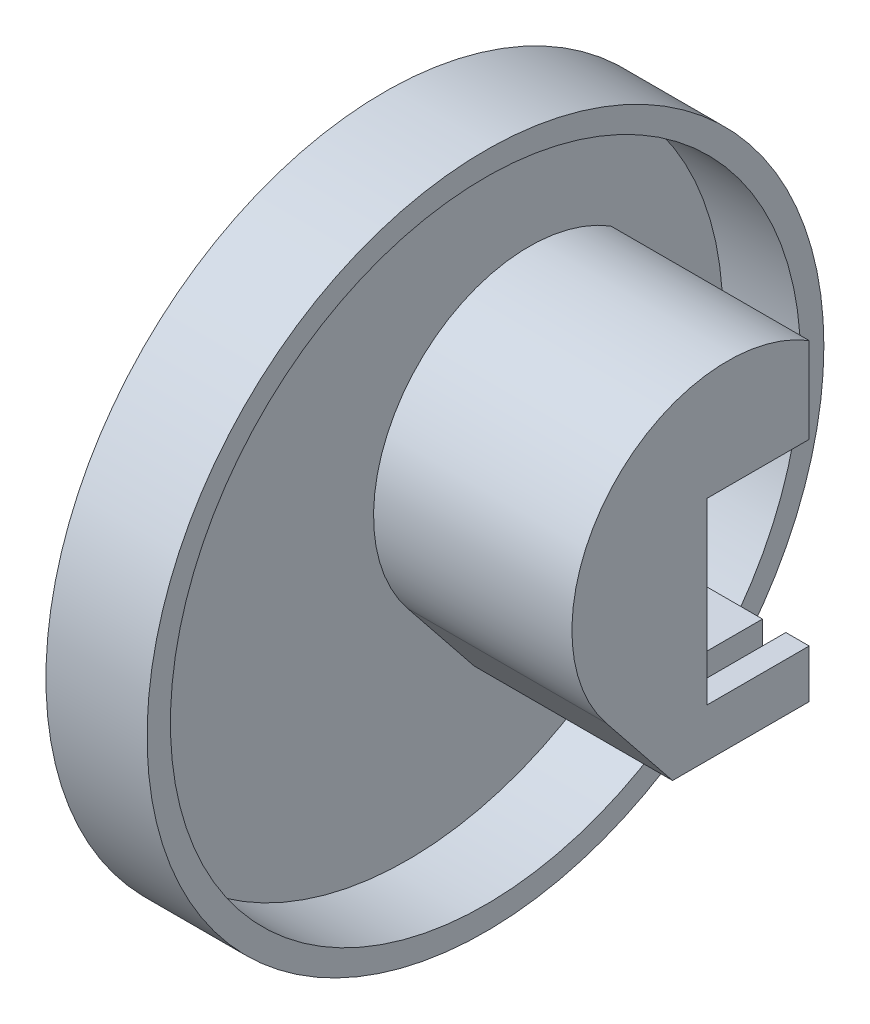
ISO-10303-21;
HEADER;
FILE_DESCRIPTION(('STEP AP214'),'2;1');
FILE_NAME('part.step','',(''),(''),'','','');
FILE_SCHEMA(('AUTOMOTIVE_DESIGN { 1 0 10303 214 1 1 1 1 }'));
ENDSEC;
DATA;
#1=APPLICATION_CONTEXT('core data for automotive mechanical design processes');
#2=APPLICATION_PROTOCOL_DEFINITION('international standard','automotive_design',2000,#1);
#3=PRODUCT_CONTEXT('',#1,'mechanical');
#4=PRODUCT('Part','Part','',(#3));
#5=PRODUCT_RELATED_PRODUCT_CATEGORY('part','',(#4));
#6=PRODUCT_DEFINITION_FORMATION('','',#4);
#7=PRODUCT_DEFINITION_CONTEXT('part definition',#1,'design');
#8=PRODUCT_DEFINITION('design','',#6,#7);
#9=PRODUCT_DEFINITION_SHAPE('','',#8);
#10=(LENGTH_UNIT() NAMED_UNIT(*) SI_UNIT(.MILLI.,.METRE.));
#11=(NAMED_UNIT(*) PLANE_ANGLE_UNIT() SI_UNIT($,.RADIAN.));
#12=(NAMED_UNIT(*) SI_UNIT($,.STERADIAN.) SOLID_ANGLE_UNIT());
#13=UNCERTAINTY_MEASURE_WITH_UNIT(LENGTH_MEASURE(1.E-05),#10,'distance_accuracy_value','');
#14=(GEOMETRIC_REPRESENTATION_CONTEXT(3) GLOBAL_UNCERTAINTY_ASSIGNED_CONTEXT((#13)) GLOBAL_UNIT_ASSIGNED_CONTEXT((#10,
#11,#12)) REPRESENTATION_CONTEXT('',''));
#15=CARTESIAN_POINT('',(0.,0.,0.));
#16=DIRECTION('',(0.,0.,1.));
#17=DIRECTION('',(1.,0.,0.));
#18=AXIS2_PLACEMENT_3D('',#15,#16,#17);
#19=CARTESIAN_POINT('',(19.5,0.,-15.612494995996));
#20=DIRECTION('',(1.,0.,0.));
#21=DIRECTION('',(0.,0.,-1.));
#22=AXIS2_PLACEMENT_3D('',#19,#20,#21);
#23=PLANE('',#22);
#24=DIRECTION('',(0.,1.,0.));
#25=VECTOR('',#24,1.);
#26=CARTESIAN_POINT('',(19.5,0.,-13.));
#27=LINE('',#26,#25);
#28=CARTESIAN_POINT('',(19.5,-23.1771451300606,-13.));
#29=VERTEX_POINT('',#28);
#30=CARTESIAN_POINT('',(19.5,-16.9771451300606,-13.));
#31=VERTEX_POINT('',#30);
#32=EDGE_CURVE('E51',#29,#31,#27,.T.);
#33=ORIENTED_EDGE('',*,*,#32,.F.);
#34=DIRECTION('',(0.,0.,-1.));
#35=VECTOR('',#34,1.);
#36=CARTESIAN_POINT('',(19.5,-23.1771451300607,0.));
#37=LINE('',#36,#35);
#38=CARTESIAN_POINT('',(19.5,-23.1771451300606,-26.1111812031832));
#39=VERTEX_POINT('',#38);
#40=EDGE_CURVE('E231',#29,#39,#37,.T.);
#41=ORIENTED_EDGE('',*,*,#40,.T.);
#42=DIRECTION('',(0.,1.,0.));
#43=VECTOR('',#42,1.);
#44=CARTESIAN_POINT('',(19.5,0.,-26.1111812031832));
#45=LINE('',#44,#43);
#46=CARTESIAN_POINT('',(19.5,-16.9771451300606,-26.1111812031832));
#47=VERTEX_POINT('',#46);
#48=EDGE_CURVE('E233',#39,#47,#45,.T.);
#49=ORIENTED_EDGE('',*,*,#48,.T.);
#50=DIRECTION('',(0.,0.,1.));
#51=VECTOR('',#50,1.);
#52=CARTESIAN_POINT('',(19.5,-16.9771451300606,0.));
#53=LINE('',#52,#51);
#54=EDGE_CURVE('E222',#47,#31,#53,.T.);
#55=ORIENTED_EDGE('',*,*,#54,.T.);
#56=EDGE_LOOP('',(#33,#41,#49,#55));
#57=FACE_BOUND('',#56,.T.);
#58=ADVANCED_FACE('F41',(#57),#23,.T.);
#59=CARTESIAN_POINT('',(10.,0.,0.));
#60=DIRECTION('',(1.,0.,0.));
#61=DIRECTION('',(0.,0.,-1.));
#62=AXIS2_PLACEMENT_3D('',#59,#60,#61);
#63=PLANE('',#62);
#64=CARTESIAN_POINT('',(10.,0.,0.));
#65=DIRECTION('',(1.,0.,0.));
#66=DIRECTION('',(0.,0.,-1.));
#67=AXIS2_PLACEMENT_3D('',#64,#65,#66);
#68=CIRCLE('',#67,43.5);
#69=CARTESIAN_POINT('',(10.,0.,-43.5));
#70=VERTEX_POINT('',#69);
#71=EDGE_CURVE('E45',#70,#70,#68,.T.);
#72=ORIENTED_EDGE('',*,*,#71,.T.);
#73=EDGE_LOOP('',(#72));
#74=FACE_BOUND('',#73,.T.);
#75=CARTESIAN_POINT('',(10.,0.,0.));
#76=DIRECTION('',(1.,0.,0.));
#77=DIRECTION('',(0.,0.,-1.));
#78=AXIS2_PLACEMENT_3D('',#75,#76,#77);
#79=CIRCLE('',#78,40.5);
#80=CARTESIAN_POINT('',(10.,0.,-40.5));
#81=VERTEX_POINT('',#80);
#82=EDGE_CURVE('E301',#81,#81,#79,.T.);
#83=ORIENTED_EDGE('',*,*,#82,.F.);
#84=EDGE_LOOP('',(#83));
#85=FACE_BOUND('',#84,.T.);
#86=ADVANCED_FACE('F320',(#74,#85),#63,.T.);
#87=CARTESIAN_POINT('',(10.,0.,0.));
#88=DIRECTION('',(-1.,0.,0.));
#89=DIRECTION('',(0.,0.,1.));
#90=AXIS2_PLACEMENT_3D('',#87,#88,#89);
#91=CYLINDRICAL_SURFACE('',#90,43.5);
#92=ORIENTED_EDGE('',*,*,#71,.F.);
#93=EDGE_LOOP('',(#92));
#94=FACE_BOUND('',#93,.T.);
#95=CARTESIAN_POINT('',(-3.,0.,0.));
#96=DIRECTION('',(1.,0.,0.));
#97=DIRECTION('',(0.,0.,-1.));
#98=AXIS2_PLACEMENT_3D('',#95,#96,#97);
#99=CIRCLE('',#98,43.5);
#100=CARTESIAN_POINT('',(-3.,0.,-43.5));
#101=VERTEX_POINT('',#100);
#102=EDGE_CURVE('E297',#101,#101,#99,.T.);
#103=ORIENTED_EDGE('',*,*,#102,.T.);
#104=EDGE_LOOP('',(#103));
#105=FACE_BOUND('',#104,.T.);
#106=ADVANCED_FACE('F43',(#94,#105),#91,.T.);
#107=CARTESIAN_POINT('',(10.,0.,0.));
#108=DIRECTION('',(-1.,0.,0.));
#109=DIRECTION('',(0.,0.,1.));
#110=AXIS2_PLACEMENT_3D('',#107,#108,#109);
#111=CYLINDRICAL_SURFACE('',#110,40.5);
#112=ORIENTED_EDGE('',*,*,#82,.T.);
#113=EDGE_LOOP('',(#112));
#114=FACE_BOUND('',#113,.T.);
#115=CARTESIAN_POINT('',(0.,0.,0.));
#116=DIRECTION('',(1.,0.,0.));
#117=DIRECTION('',(0.,0.,-1.));
#118=AXIS2_PLACEMENT_3D('',#115,#116,#117);
#119=CIRCLE('',#118,40.5);
#120=CARTESIAN_POINT('',(0.,0.,-40.5));
#121=VERTEX_POINT('',#120);
#122=EDGE_CURVE('E300',#121,#121,#119,.T.);
#123=ORIENTED_EDGE('',*,*,#122,.F.);
#124=EDGE_LOOP('',(#123));
#125=FACE_BOUND('',#124,.T.);
#126=ADVANCED_FACE('F308',(#114,#125),#111,.F.);
#127=CARTESIAN_POINT('',(0.,0.,0.));
#128=DIRECTION('',(1.,0.,0.));
#129=DIRECTION('',(0.,0.,-1.));
#130=AXIS2_PLACEMENT_3D('',#127,#128,#129);
#131=PLANE('',#130);
#132=DIRECTION('',(0.,-1.,0.));
#133=VECTOR('',#132,1.);
#134=CARTESIAN_POINT('',(0.,0.,-13.));
#135=LINE('',#134,#133);
#136=CARTESIAN_POINT('',(0.,-15.6771451300606,-13.));
#137=VERTEX_POINT('',#136);
#138=CARTESIAN_POINT('',(0.,-23.1771451300606,-13.));
#139=VERTEX_POINT('',#138);
#140=EDGE_CURVE('E261',#137,#139,#135,.T.);
#141=ORIENTED_EDGE('',*,*,#140,.T.);
#142=DIRECTION('',(0.,0.,1.));
#143=VECTOR('',#142,1.);
#144=CARTESIAN_POINT('',(0.,-23.1771451300607,0.));
#145=LINE('',#144,#143);
#146=CARTESIAN_POINT('',(0.,-23.1771451300607,-8.54855768792795));
#147=VERTEX_POINT('',#146);
#148=EDGE_CURVE('E264',#139,#147,#145,.T.);
#149=ORIENTED_EDGE('',*,*,#148,.T.);
#150=DIRECTION('',(0.,0.7806247497998,0.625));
#151=VECTOR('',#150,1.);
#152=CARTESIAN_POINT('',(0.,-4.8828125,6.09863085781094));
#153=LINE('',#152,#151);
#154=CARTESIAN_POINT('',(0.,-12.5,0.));
#155=VERTEX_POINT('',#154);
#156=EDGE_CURVE('E277',#147,#155,#153,.T.);
#157=ORIENTED_EDGE('',*,*,#156,.T.);
#158=CARTESIAN_POINT('',(0.,0.,-15.612494995996));
#159=DIRECTION('',(1.,0.,0.));
#160=DIRECTION('',(0.,0.,-1.));
#161=AXIS2_PLACEMENT_3D('',#158,#159,#160);
#162=CIRCLE('',#161,20.);
#163=CARTESIAN_POINT('',(0.,17.0228548699394,-26.1111812031832));
#164=VERTEX_POINT('',#163);
#165=EDGE_CURVE('E274',#164,#155,#162,.T.);
#166=ORIENTED_EDGE('',*,*,#165,.F.);
#167=DIRECTION('',(0.,-1.,0.));
#168=VECTOR('',#167,1.);
#169=CARTESIAN_POINT('',(0.,0.,-26.1111812031832));
#170=LINE('',#169,#168);
#171=CARTESIAN_POINT('',(0.,15.5228548699394,-26.1111812031832));
#172=VERTEX_POINT('',#171);
#173=EDGE_CURVE('E272',#164,#172,#170,.T.);
#174=ORIENTED_EDGE('',*,*,#173,.T.);
#175=CARTESIAN_POINT('',(0.,0.13117056936177,-19.0598725025692));
#176=DIRECTION('',(1.,0.,0.));
#177=DIRECTION('',(0.,0.,-1.));
#178=AXIS2_PLACEMENT_3D('',#175,#176,#177);
#179=CIRCLE('',#178,16.93);
#180=EDGE_CURVE('E269',#137,#172,#179,.F.);
#181=ORIENTED_EDGE('',*,*,#180,.F.);
#182=EDGE_LOOP('',(#141,#149,#157,#166,#174,#181));
#183=FACE_BOUND('',#182,.T.);
#184=ORIENTED_EDGE('',*,*,#122,.T.);
#185=EDGE_LOOP('',(#184));
#186=FACE_BOUND('',#185,.T.);
#187=ADVANCED_FACE('F306',(#183,#186),#131,.T.);
#188=CARTESIAN_POINT('',(-3.,0.,0.));
#189=DIRECTION('',(1.,0.,0.));
#190=DIRECTION('',(0.,0.,-1.));
#191=AXIS2_PLACEMENT_3D('',#188,#189,#190);
#192=PLANE('',#191);
#193=ORIENTED_EDGE('',*,*,#102,.F.);
#194=EDGE_LOOP('',(#193));
#195=FACE_BOUND('',#194,.T.);
#196=ADVANCED_FACE('F317',(#195),#192,.F.);
#197=CARTESIAN_POINT('',(12.,0.,-13.));
#198=DIRECTION('',(0.,0.,-1.));
#199=DIRECTION('',(0.,1.,0.));
#200=AXIS2_PLACEMENT_3D('',#197,#198,#199);
#201=PLANE('',#200);
#202=ORIENTED_EDGE('',*,*,#140,.F.);
#203=DIRECTION('',(-1.,0.,0.));
#204=VECTOR('',#203,1.);
#205=CARTESIAN_POINT('',(12.,-15.6771451300606,-13.));
#206=LINE('',#205,#204);
#207=CARTESIAN_POINT('',(12.,-15.6771451300606,-13.));
#208=VERTEX_POINT('',#207);
#209=EDGE_CURVE('E294',#208,#137,#206,.T.);
#210=ORIENTED_EDGE('',*,*,#209,.F.);
#211=DIRECTION('',(0.,1.,0.));
#212=VECTOR('',#211,1.);
#213=CARTESIAN_POINT('',(12.,0.,-13.));
#214=LINE('',#213,#212);
#215=CARTESIAN_POINT('',(12.,6.02285486993935,-13.));
#216=VERTEX_POINT('',#215);
#217=EDGE_CURVE('E238',#208,#216,#214,.T.);
#218=ORIENTED_EDGE('',*,*,#217,.T.);
#219=DIRECTION('',(-1.,0.,0.));
#220=VECTOR('',#219,1.);
#221=CARTESIAN_POINT('',(19.5,6.02285486993935,-13.));
#222=LINE('',#221,#220);
#223=CARTESIAN_POINT('',(19.5,6.02285486993935,-13.));
#224=VERTEX_POINT('',#223);
#225=EDGE_CURVE('E256',#224,#216,#222,.T.);
#226=ORIENTED_EDGE('',*,*,#225,.F.);
#227=CARTESIAN_POINT('',(19.5,11.3228548699394,-13.));
#228=VERTEX_POINT('',#227);
#229=EDGE_CURVE('E11',#224,#228,#27,.T.);
#230=ORIENTED_EDGE('',*,*,#229,.T.);
#231=DIRECTION('',(-1.,0.,0.));
#232=VECTOR('',#231,1.);
#233=CARTESIAN_POINT('',(22.5,11.3228548699394,-13.));
#234=LINE('',#233,#232);
#235=CARTESIAN_POINT('',(22.5,11.3228548699394,-13.));
#236=VERTEX_POINT('',#235);
#237=EDGE_CURVE('E58',#236,#228,#234,.T.);
#238=ORIENTED_EDGE('',*,*,#237,.F.);
#239=DIRECTION('',(0.,1.,0.));
#240=VECTOR('',#239,1.);
#241=CARTESIAN_POINT('',(22.5,0.,-13.));
#242=LINE('',#241,#240);
#243=CARTESIAN_POINT('',(22.5,6.02285486993935,-13.));
#244=VERTEX_POINT('',#243);
#245=EDGE_CURVE('E212',#244,#236,#242,.T.);
#246=ORIENTED_EDGE('',*,*,#245,.F.);
#247=DIRECTION('',(-1.,0.,0.));
#248=VECTOR('',#247,1.);
#249=CARTESIAN_POINT('',(25.5,6.02285486993935,-13.));
#250=LINE('',#249,#248);
#251=CARTESIAN_POINT('',(25.5,6.02285486993935,-13.));
#252=VERTEX_POINT('',#251);
#253=EDGE_CURVE('E185',#252,#244,#250,.T.);
#254=ORIENTED_EDGE('',*,*,#253,.F.);
#255=DIRECTION('',(0.,1.,0.));
#256=VECTOR('',#255,1.);
#257=CARTESIAN_POINT('',(25.5,0.,-13.));
#258=LINE('',#257,#256);
#259=CARTESIAN_POINT('',(25.5,-16.9771451300606,-13.));
#260=VERTEX_POINT('',#259);
#261=EDGE_CURVE('E176',#260,#252,#258,.T.);
#262=ORIENTED_EDGE('',*,*,#261,.F.);
#263=DIRECTION('',(-1.,0.,0.));
#264=VECTOR('',#263,1.);
#265=CARTESIAN_POINT('',(25.5,-16.9771451300606,-13.));
#266=LINE('',#265,#264);
#267=CARTESIAN_POINT('',(22.5,-16.9771451300606,-13.));
#268=VERTEX_POINT('',#267);
#269=EDGE_CURVE('E182',#260,#268,#266,.T.);
#270=ORIENTED_EDGE('',*,*,#269,.T.);
#271=CARTESIAN_POINT('',(22.5,-23.1771451300606,-13.));
#272=VERTEX_POINT('',#271);
#273=EDGE_CURVE('E209',#272,#268,#242,.T.);
#274=ORIENTED_EDGE('',*,*,#273,.F.);
#275=DIRECTION('',(-1.,0.,0.));
#276=VECTOR('',#275,1.);
#277=CARTESIAN_POINT('',(22.5,-23.1771451300606,-13.));
#278=LINE('',#277,#276);
#279=EDGE_CURVE('E213',#272,#29,#278,.T.);
#280=ORIENTED_EDGE('',*,*,#279,.T.);
#281=ORIENTED_EDGE('',*,*,#32,.T.);
#282=DIRECTION('',(-1.,0.,0.));
#283=VECTOR('',#282,1.);
#284=CARTESIAN_POINT('',(19.5,-16.9771451300606,-13.));
#285=LINE('',#284,#283);
#286=CARTESIAN_POINT('',(12.,-16.9771451300606,-13.));
#287=VERTEX_POINT('',#286);
#288=EDGE_CURVE('E259',#31,#287,#285,.T.);
#289=ORIENTED_EDGE('',*,*,#288,.T.);
#290=DIRECTION('',(0.,-1.,0.));
#291=VECTOR('',#290,1.);
#292=CARTESIAN_POINT('',(12.,0.,-13.));
#293=LINE('',#292,#291);
#294=CARTESIAN_POINT('',(12.,-23.1771451300606,-13.));
#295=VERTEX_POINT('',#294);
#296=EDGE_CURVE('E65',#287,#295,#293,.T.);
#297=ORIENTED_EDGE('',*,*,#296,.T.);
#298=DIRECTION('',(-1.,0.,0.));
#299=VECTOR('',#298,1.);
#300=CARTESIAN_POINT('',(12.,-23.1771451300606,-13.));
#301=LINE('',#300,#299);
#302=EDGE_CURVE('E267',#295,#139,#301,.T.);
#303=ORIENTED_EDGE('',*,*,#302,.T.);
#304=EDGE_LOOP('',(#202,#210,#218,#226,#230,#238,#246,#254,#262,#270,#274,#280,#281,#289,#297,#303));
#305=FACE_BOUND('',#304,.T.);
#306=ADVANCED_FACE('F179',(#305),#201,.T.);
#307=CARTESIAN_POINT('',(12.,0.13117056936177,-19.0598725025692));
#308=DIRECTION('',(-1.,0.,0.));
#309=DIRECTION('',(0.,0.,1.));
#310=AXIS2_PLACEMENT_3D('',#307,#308,#309);
#311=CYLINDRICAL_SURFACE('',#310,16.93);
#312=ORIENTED_EDGE('',*,*,#180,.T.);
#313=DIRECTION('',(-1.,0.,0.));
#314=VECTOR('',#313,1.);
#315=CARTESIAN_POINT('',(12.,15.5228548699394,-26.1111812031832));
#316=LINE('',#315,#314);
#317=CARTESIAN_POINT('',(12.,15.5228548699394,-26.1111812031832));
#318=VERTEX_POINT('',#317);
#319=EDGE_CURVE('E291',#318,#172,#316,.T.);
#320=ORIENTED_EDGE('',*,*,#319,.F.);
#321=CARTESIAN_POINT('',(12.,0.13117056936177,-19.0598725025692));
#322=DIRECTION('',(1.,0.,0.));
#323=DIRECTION('',(0.,0.,-1.));
#324=AXIS2_PLACEMENT_3D('',#321,#322,#323);
#325=CIRCLE('',#324,16.93);
#326=EDGE_CURVE('E263',#208,#318,#325,.F.);
#327=ORIENTED_EDGE('',*,*,#326,.F.);
#328=ORIENTED_EDGE('',*,*,#209,.T.);
#329=EDGE_LOOP('',(#312,#320,#327,#328));
#330=FACE_BOUND('',#329,.T.);
#331=ADVANCED_FACE('F536',(#330),#311,.F.);
#332=CARTESIAN_POINT('',(12.,0.,-26.1111812031832));
#333=DIRECTION('',(0.,0.,-1.));
#334=DIRECTION('',(-1.,0.,0.));
#335=AXIS2_PLACEMENT_3D('',#332,#333,#334);
#336=PLANE('',#335);
#337=ORIENTED_EDGE('',*,*,#173,.F.);
#338=DIRECTION('',(-1.,0.,0.));
#339=VECTOR('',#338,1.);
#340=CARTESIAN_POINT('',(12.,17.0228548699394,-26.1111812031832));
#341=LINE('',#340,#339);
#342=CARTESIAN_POINT('',(25.5,17.0228548699394,-26.1111812031832));
#343=VERTEX_POINT('',#342);
#344=EDGE_CURVE('E288',#343,#164,#341,.T.);
#345=ORIENTED_EDGE('',*,*,#344,.F.);
#346=DIRECTION('',(0.,1.,0.));
#347=VECTOR('',#346,1.);
#348=CARTESIAN_POINT('',(25.5,0.,-26.1111812031832));
#349=LINE('',#348,#347);
#350=CARTESIAN_POINT('',(25.5,6.02285486993935,-26.1111812031832));
#351=VERTEX_POINT('',#350);
#352=EDGE_CURVE('E667',#351,#343,#349,.T.);
#353=ORIENTED_EDGE('',*,*,#352,.F.);
#354=DIRECTION('',(-1.,0.,0.));
#355=VECTOR('',#354,1.);
#356=CARTESIAN_POINT('',(25.5,6.02285486993935,-26.1111812031832));
#357=LINE('',#356,#355);
#358=CARTESIAN_POINT('',(22.5,6.02285486993935,-26.1111812031832));
#359=VERTEX_POINT('',#358);
#360=EDGE_CURVE('E205',#351,#359,#357,.T.);
#361=ORIENTED_EDGE('',*,*,#360,.T.);
#362=DIRECTION('',(0.,1.,0.));
#363=VECTOR('',#362,1.);
#364=CARTESIAN_POINT('',(22.5,0.,-26.1111812031832));
#365=LINE('',#364,#363);
#366=CARTESIAN_POINT('',(22.5,11.3228548699394,-26.1111812031832));
#367=VERTEX_POINT('',#366);
#368=EDGE_CURVE('E363',#359,#367,#365,.T.);
#369=ORIENTED_EDGE('',*,*,#368,.T.);
#370=DIRECTION('',(-1.,0.,0.));
#371=VECTOR('',#370,1.);
#372=CARTESIAN_POINT('',(22.5,11.3228548699394,-26.1111812031832));
#373=LINE('',#372,#371);
#374=CARTESIAN_POINT('',(19.5,11.3228548699394,-26.1111812031832));
#375=VERTEX_POINT('',#374);
#376=EDGE_CURVE('E218',#367,#375,#373,.T.);
#377=ORIENTED_EDGE('',*,*,#376,.T.);
#378=DIRECTION('',(0.,1.,0.));
#379=VECTOR('',#378,1.);
#380=CARTESIAN_POINT('',(19.5,0.,-26.1111812031832));
#381=LINE('',#380,#379);
#382=CARTESIAN_POINT('',(19.5,6.02285486993935,-26.1111812031832));
#383=VERTEX_POINT('',#382);
#384=EDGE_CURVE('E228',#383,#375,#381,.T.);
#385=ORIENTED_EDGE('',*,*,#384,.F.);
#386=DIRECTION('',(-1.,0.,0.));
#387=VECTOR('',#386,1.);
#388=CARTESIAN_POINT('',(19.5,6.02285486993935,-26.1111812031832));
#389=LINE('',#388,#387);
#390=CARTESIAN_POINT('',(12.,6.02285486993935,-26.1111812031832));
#391=VERTEX_POINT('',#390);
#392=EDGE_CURVE('E253',#383,#391,#389,.T.);
#393=ORIENTED_EDGE('',*,*,#392,.T.);
#394=DIRECTION('',(0.,1.,0.));
#395=VECTOR('',#394,1.);
#396=CARTESIAN_POINT('',(12.,0.,-26.1111812031832));
#397=LINE('',#396,#395);
#398=EDGE_CURVE('E242',#391,#318,#397,.T.);
#399=ORIENTED_EDGE('',*,*,#398,.T.);
#400=ORIENTED_EDGE('',*,*,#319,.T.);
#401=EDGE_LOOP('',(#337,#345,#353,#361,#369,#377,#385,#393,#399,#400));
#402=FACE_BOUND('',#401,.T.);
#403=ADVANCED_FACE('F358',(#402),#336,.T.);
#404=CARTESIAN_POINT('',(12.,0.,-15.612494995996));
#405=DIRECTION('',(-1.,0.,0.));
#406=DIRECTION('',(0.,0.,1.));
#407=AXIS2_PLACEMENT_3D('',#404,#405,#406);
#408=CYLINDRICAL_SURFACE('',#407,20.);
#409=ORIENTED_EDGE('',*,*,#165,.T.);
#410=DIRECTION('',(-1.,0.,0.));
#411=VECTOR('',#410,1.);
#412=CARTESIAN_POINT('',(12.,-12.5,0.));
#413=LINE('',#412,#411);
#414=CARTESIAN_POINT('',(25.5,-12.5,0.));
#415=VERTEX_POINT('',#414);
#416=EDGE_CURVE('E285',#415,#155,#413,.T.);
#417=ORIENTED_EDGE('',*,*,#416,.F.);
#418=CARTESIAN_POINT('',(25.5,0.,-15.612494995996));
#419=DIRECTION('',(1.,0.,0.));
#420=DIRECTION('',(0.,0.,-1.));
#421=AXIS2_PLACEMENT_3D('',#418,#419,#420);
#422=CIRCLE('',#421,20.);
#423=EDGE_CURVE('E671',#343,#415,#422,.T.);
#424=ORIENTED_EDGE('',*,*,#423,.F.);
#425=ORIENTED_EDGE('',*,*,#344,.T.);
#426=EDGE_LOOP('',(#409,#417,#424,#425));
#427=FACE_BOUND('',#426,.T.);
#428=ADVANCED_FACE('F517',(#427),#408,.T.);
#429=CARTESIAN_POINT('',(12.,-4.8828125,6.09863085781094));
#430=DIRECTION('',(0.,-0.625,0.7806247497998));
#431=DIRECTION('',(0.,-0.7806247497998,-0.625));
#432=AXIS2_PLACEMENT_3D('',#429,#430,#431);
#433=PLANE('',#432);
#434=ORIENTED_EDGE('',*,*,#156,.F.);
#435=DIRECTION('',(-1.,0.,0.));
#436=VECTOR('',#435,1.);
#437=CARTESIAN_POINT('',(12.,-23.1771451300607,-8.54855768792795));
#438=LINE('',#437,#436);
#439=CARTESIAN_POINT('',(25.5,-23.1771451300606,-8.54855768792795));
#440=VERTEX_POINT('',#439);
#441=EDGE_CURVE('E282',#440,#147,#438,.T.);
#442=ORIENTED_EDGE('',*,*,#441,.F.);
#443=DIRECTION('',(0.,-0.7806247497998,-0.625));
#444=VECTOR('',#443,1.);
#445=CARTESIAN_POINT('',(25.5,-12.5,0.));
#446=LINE('',#445,#444);
#447=EDGE_CURVE('E675',#415,#440,#446,.T.);
#448=ORIENTED_EDGE('',*,*,#447,.F.);
#449=ORIENTED_EDGE('',*,*,#416,.T.);
#450=EDGE_LOOP('',(#434,#442,#448,#449));
#451=FACE_BOUND('',#450,.T.);
#452=ADVANCED_FACE('F507',(#451),#433,.T.);
#453=CARTESIAN_POINT('',(12.,-23.1771451300607,0.));
#454=DIRECTION('',(0.,-1.,0.));
#455=DIRECTION('',(0.,0.,-1.));
#456=AXIS2_PLACEMENT_3D('',#453,#454,#455);
#457=PLANE('',#456);
#458=ORIENTED_EDGE('',*,*,#148,.F.);
#459=ORIENTED_EDGE('',*,*,#302,.F.);
#460=DIRECTION('',(0.,0.,-1.));
#461=VECTOR('',#460,1.);
#462=CARTESIAN_POINT('',(12.,-23.1771451300607,0.));
#463=LINE('',#462,#461);
#464=CARTESIAN_POINT('',(12.,-23.1771451300606,-26.1111812031832));
#465=VERTEX_POINT('',#464);
#466=EDGE_CURVE('E245',#295,#465,#463,.T.);
#467=ORIENTED_EDGE('',*,*,#466,.T.);
#468=DIRECTION('',(-1.,0.,0.));
#469=VECTOR('',#468,1.);
#470=CARTESIAN_POINT('',(19.5,-23.1771451300606,-26.1111812031832));
#471=LINE('',#470,#469);
#472=EDGE_CURVE('E250',#39,#465,#471,.T.);
#473=ORIENTED_EDGE('',*,*,#472,.F.);
#474=ORIENTED_EDGE('',*,*,#40,.F.);
#475=ORIENTED_EDGE('',*,*,#279,.F.);
#476=DIRECTION('',(0.,0.,-1.));
#477=VECTOR('',#476,1.);
#478=CARTESIAN_POINT('',(22.5,-23.1771451300606,-15.612494995996));
#479=LINE('',#478,#477);
#480=CARTESIAN_POINT('',(22.5,-23.1771451300606,-26.1111812031832));
#481=VERTEX_POINT('',#480);
#482=EDGE_CURVE('E688',#272,#481,#479,.T.);
#483=ORIENTED_EDGE('',*,*,#482,.T.);
#484=DIRECTION('',(-1.,0.,0.));
#485=VECTOR('',#484,1.);
#486=CARTESIAN_POINT('',(25.5,-23.1771451300606,-26.1111812031832));
#487=LINE('',#486,#485);
#488=CARTESIAN_POINT('',(25.5,-23.1771451300606,-26.1111812031832));
#489=VERTEX_POINT('',#488);
#490=EDGE_CURVE('E692',#489,#481,#487,.T.);
#491=ORIENTED_EDGE('',*,*,#490,.F.);
#492=DIRECTION('',(0.,0.,-1.));
#493=VECTOR('',#492,1.);
#494=CARTESIAN_POINT('',(25.5,-23.1771451300606,-15.612494995996));
#495=LINE('',#494,#493);
#496=EDGE_CURVE('E677',#440,#489,#495,.T.);
#497=ORIENTED_EDGE('',*,*,#496,.F.);
#498=ORIENTED_EDGE('',*,*,#441,.T.);
#499=EDGE_LOOP('',(#458,#459,#467,#473,#474,#475,#483,#491,#497,#498));
#500=FACE_BOUND('',#499,.T.);
#501=ADVANCED_FACE('F498',(#500),#457,.T.);
#502=CARTESIAN_POINT('',(12.,0.,-15.612494995996));
#503=DIRECTION('',(1.,0.,0.));
#504=DIRECTION('',(0.,0.,-1.));
#505=AXIS2_PLACEMENT_3D('',#502,#503,#504);
#506=PLANE('',#505);
#507=ORIENTED_EDGE('',*,*,#217,.F.);
#508=ORIENTED_EDGE('',*,*,#326,.T.);
#509=ORIENTED_EDGE('',*,*,#398,.F.);
#510=DIRECTION('',(0.,0.,-1.));
#511=VECTOR('',#510,1.);
#512=CARTESIAN_POINT('',(12.,6.02285486993935,0.));
#513=LINE('',#512,#511);
#514=EDGE_CURVE('E240',#216,#391,#513,.T.);
#515=ORIENTED_EDGE('',*,*,#514,.F.);
#516=EDGE_LOOP('',(#507,#508,#509,#515));
#517=FACE_BOUND('',#516,.T.);
#518=ADVANCED_FACE('F343',(#517),#506,.F.);
#519=CARTESIAN_POINT('',(19.5,-16.9771451300606,0.));
#520=DIRECTION('',(0.,-1.,0.));
#521=DIRECTION('',(0.,0.,-1.));
#522=AXIS2_PLACEMENT_3D('',#519,#520,#521);
#523=PLANE('',#522);
#524=DIRECTION('',(0.,0.,1.));
#525=VECTOR('',#524,1.);
#526=CARTESIAN_POINT('',(12.,-16.9771451300606,0.));
#527=LINE('',#526,#525);
#528=CARTESIAN_POINT('',(12.,-16.9771451300606,-26.1111812031832));
#529=VERTEX_POINT('',#528);
#530=EDGE_CURVE('E221',#529,#287,#527,.T.);
#531=ORIENTED_EDGE('',*,*,#530,.T.);
#532=ORIENTED_EDGE('',*,*,#288,.F.);
#533=ORIENTED_EDGE('',*,*,#54,.F.);
#534=DIRECTION('',(-1.,0.,0.));
#535=VECTOR('',#534,1.);
#536=CARTESIAN_POINT('',(19.5,-16.9771451300606,-26.1111812031832));
#537=LINE('',#536,#535);
#538=EDGE_CURVE('E235',#47,#529,#537,.T.);
#539=ORIENTED_EDGE('',*,*,#538,.T.);
#540=EDGE_LOOP('',(#531,#532,#533,#539));
#541=FACE_BOUND('',#540,.T.);
#542=ADVANCED_FACE('F482',(#541),#523,.F.);
#543=CARTESIAN_POINT('',(19.5,6.02285486993935,0.));
#544=DIRECTION('',(0.,1.,0.));
#545=DIRECTION('',(0.,0.,1.));
#546=AXIS2_PLACEMENT_3D('',#543,#544,#545);
#547=PLANE('',#546);
#548=ORIENTED_EDGE('',*,*,#514,.T.);
#549=ORIENTED_EDGE('',*,*,#392,.F.);
#550=DIRECTION('',(0.,0.,-1.));
#551=VECTOR('',#550,1.);
#552=CARTESIAN_POINT('',(19.5,6.02285486993935,0.));
#553=LINE('',#552,#551);
#554=EDGE_CURVE('E225',#224,#383,#553,.T.);
#555=ORIENTED_EDGE('',*,*,#554,.F.);
#556=ORIENTED_EDGE('',*,*,#225,.T.);
#557=EDGE_LOOP('',(#548,#549,#555,#556));
#558=FACE_BOUND('',#557,.T.);
#559=ADVANCED_FACE('F345',(#558),#547,.F.);
#560=CARTESIAN_POINT('',(19.5,0.,-26.1111812031832));
#561=DIRECTION('',(0.,0.,1.));
#562=DIRECTION('',(0.,-1.,0.));
#563=AXIS2_PLACEMENT_3D('',#560,#561,#562);
#564=PLANE('',#563);
#565=DIRECTION('',(0.,1.,0.));
#566=VECTOR('',#565,1.);
#567=CARTESIAN_POINT('',(12.,0.,-26.1111812031832));
#568=LINE('',#567,#566);
#569=EDGE_CURVE('E226',#465,#529,#568,.T.);
#570=ORIENTED_EDGE('',*,*,#569,.T.);
#571=ORIENTED_EDGE('',*,*,#538,.F.);
#572=ORIENTED_EDGE('',*,*,#48,.F.);
#573=ORIENTED_EDGE('',*,*,#472,.T.);
#574=EDGE_LOOP('',(#570,#571,#572,#573));
#575=FACE_BOUND('',#574,.T.);
#576=ADVANCED_FACE('F336',(#575),#564,.F.);
#577=ORIENTED_EDGE('',*,*,#229,.F.);
#578=ORIENTED_EDGE('',*,*,#554,.T.);
#579=ORIENTED_EDGE('',*,*,#384,.T.);
#580=DIRECTION('',(0.,0.,1.));
#581=VECTOR('',#580,1.);
#582=CARTESIAN_POINT('',(19.5,11.3228548699394,-15.612494995996));
#583=LINE('',#582,#581);
#584=EDGE_CURVE('E204',#375,#228,#583,.T.);
#585=ORIENTED_EDGE('',*,*,#584,.T.);
#586=EDGE_LOOP('',(#577,#578,#579,#585));
#587=FACE_BOUND('',#586,.T.);
#588=ADVANCED_FACE('F325',(#587),#23,.T.);
#589=ORIENTED_EDGE('',*,*,#296,.F.);
#590=ORIENTED_EDGE('',*,*,#530,.F.);
#591=ORIENTED_EDGE('',*,*,#569,.F.);
#592=ORIENTED_EDGE('',*,*,#466,.F.);
#593=EDGE_LOOP('',(#589,#590,#591,#592));
#594=FACE_BOUND('',#593,.T.);
#595=ADVANCED_FACE('F335',(#594),#506,.F.);
#596=CARTESIAN_POINT('',(22.5,11.3228548699394,-15.612494995996));
#597=DIRECTION('',(0.,-1.,0.));
#598=DIRECTION('',(0.,0.,-1.));
#599=AXIS2_PLACEMENT_3D('',#596,#597,#598);
#600=PLANE('',#599);
#601=ORIENTED_EDGE('',*,*,#584,.F.);
#602=ORIENTED_EDGE('',*,*,#376,.F.);
#603=DIRECTION('',(0.,0.,1.));
#604=VECTOR('',#603,1.);
#605=CARTESIAN_POINT('',(22.5,11.3228548699394,-15.612494995996));
#606=LINE('',#605,#604);
#607=EDGE_CURVE('E211',#367,#236,#606,.T.);
#608=ORIENTED_EDGE('',*,*,#607,.T.);
#609=ORIENTED_EDGE('',*,*,#237,.T.);
#610=EDGE_LOOP('',(#601,#602,#608,#609));
#611=FACE_BOUND('',#610,.T.);
#612=ADVANCED_FACE('F342',(#611),#600,.T.);
#613=CARTESIAN_POINT('',(22.5,0.,-15.612494995996));
#614=DIRECTION('',(1.,0.,0.));
#615=DIRECTION('',(0.,0.,-1.));
#616=AXIS2_PLACEMENT_3D('',#613,#614,#615);
#617=PLANE('',#616);
#618=ORIENTED_EDGE('',*,*,#482,.F.);
#619=ORIENTED_EDGE('',*,*,#273,.T.);
#620=DIRECTION('',(0.,0.,1.));
#621=VECTOR('',#620,1.);
#622=CARTESIAN_POINT('',(22.5,-16.9771451300606,-15.612494995996));
#623=LINE('',#622,#621);
#624=CARTESIAN_POINT('',(22.5,-16.9771451300606,-26.1111812031832));
#625=VERTEX_POINT('',#624);
#626=EDGE_CURVE('E202',#625,#268,#623,.T.);
#627=ORIENTED_EDGE('',*,*,#626,.F.);
#628=DIRECTION('',(0.,1.,0.));
#629=VECTOR('',#628,1.);
#630=CARTESIAN_POINT('',(22.5,0.,-26.1111812031832));
#631=LINE('',#630,#629);
#632=EDGE_CURVE('E198',#481,#625,#631,.T.);
#633=ORIENTED_EDGE('',*,*,#632,.F.);
#634=EDGE_LOOP('',(#618,#619,#627,#633));
#635=FACE_BOUND('',#634,.T.);
#636=ADVANCED_FACE('F365',(#635),#617,.F.);
#637=DIRECTION('',(0.,0.,-1.));
#638=VECTOR('',#637,1.);
#639=CARTESIAN_POINT('',(22.5,6.02285486993935,-15.612494995996));
#640=LINE('',#639,#638);
#641=EDGE_CURVE('E685',#244,#359,#640,.T.);
#642=ORIENTED_EDGE('',*,*,#641,.F.);
#643=ORIENTED_EDGE('',*,*,#245,.T.);
#644=ORIENTED_EDGE('',*,*,#607,.F.);
#645=ORIENTED_EDGE('',*,*,#368,.F.);
#646=EDGE_LOOP('',(#642,#643,#644,#645));
#647=FACE_BOUND('',#646,.T.);
#648=ADVANCED_FACE('F370',(#647),#617,.F.);
#649=CARTESIAN_POINT('',(25.5,-16.9771451300606,-15.612494995996));
#650=DIRECTION('',(0.,-1.,0.));
#651=DIRECTION('',(0.,0.,-1.));
#652=AXIS2_PLACEMENT_3D('',#649,#650,#651);
#653=PLANE('',#652);
#654=ORIENTED_EDGE('',*,*,#626,.T.);
#655=ORIENTED_EDGE('',*,*,#269,.F.);
#656=DIRECTION('',(0.,0.,1.));
#657=VECTOR('',#656,1.);
#658=CARTESIAN_POINT('',(25.5,-16.9771451300606,-15.612494995996));
#659=LINE('',#658,#657);
#660=CARTESIAN_POINT('',(25.5,-16.9771451300606,-26.1111812031832));
#661=VERTEX_POINT('',#660);
#662=EDGE_CURVE('E189',#661,#260,#659,.T.);
#663=ORIENTED_EDGE('',*,*,#662,.F.);
#664=DIRECTION('',(-1.,0.,0.));
#665=VECTOR('',#664,1.);
#666=CARTESIAN_POINT('',(25.5,-16.9771451300606,-26.1111812031832));
#667=LINE('',#666,#665);
#668=EDGE_CURVE('E683',#661,#625,#667,.T.);
#669=ORIENTED_EDGE('',*,*,#668,.T.);
#670=EDGE_LOOP('',(#654,#655,#663,#669));
#671=FACE_BOUND('',#670,.T.);
#672=ADVANCED_FACE('F200',(#671),#653,.F.);
#673=CARTESIAN_POINT('',(25.5,6.02285486993935,-15.612494995996));
#674=DIRECTION('',(0.,1.,0.));
#675=DIRECTION('',(0.,0.,1.));
#676=AXIS2_PLACEMENT_3D('',#673,#674,#675);
#677=PLANE('',#676);
#678=ORIENTED_EDGE('',*,*,#641,.T.);
#679=ORIENTED_EDGE('',*,*,#360,.F.);
#680=DIRECTION('',(0.,0.,-1.));
#681=VECTOR('',#680,1.);
#682=CARTESIAN_POINT('',(25.5,6.02285486993935,-15.612494995996));
#683=LINE('',#682,#681);
#684=EDGE_CURVE('E188',#252,#351,#683,.T.);
#685=ORIENTED_EDGE('',*,*,#684,.F.);
#686=ORIENTED_EDGE('',*,*,#253,.T.);
#687=EDGE_LOOP('',(#678,#679,#685,#686));
#688=FACE_BOUND('',#687,.T.);
#689=ADVANCED_FACE('F376',(#688),#677,.F.);
#690=CARTESIAN_POINT('',(25.5,0.,-26.1111812031832));
#691=DIRECTION('',(0.,0.,1.));
#692=DIRECTION('',(0.,-1.,0.));
#693=AXIS2_PLACEMENT_3D('',#690,#691,#692);
#694=PLANE('',#693);
#695=ORIENTED_EDGE('',*,*,#632,.T.);
#696=ORIENTED_EDGE('',*,*,#668,.F.);
#697=DIRECTION('',(0.,1.,0.));
#698=VECTOR('',#697,1.);
#699=CARTESIAN_POINT('',(25.5,0.,-26.1111812031832));
#700=LINE('',#699,#698);
#701=EDGE_CURVE('E194',#489,#661,#700,.T.);
#702=ORIENTED_EDGE('',*,*,#701,.F.);
#703=ORIENTED_EDGE('',*,*,#490,.T.);
#704=EDGE_LOOP('',(#695,#696,#702,#703));
#705=FACE_BOUND('',#704,.T.);
#706=ADVANCED_FACE('F379',(#705),#694,.F.);
#707=CARTESIAN_POINT('',(25.5,0.,-15.612494995996));
#708=DIRECTION('',(1.,0.,0.));
#709=DIRECTION('',(0.,0.,-1.));
#710=AXIS2_PLACEMENT_3D('',#707,#708,#709);
#711=PLANE('',#710);
#712=ORIENTED_EDGE('',*,*,#662,.T.);
#713=ORIENTED_EDGE('',*,*,#261,.T.);
#714=ORIENTED_EDGE('',*,*,#684,.T.);
#715=ORIENTED_EDGE('',*,*,#352,.T.);
#716=ORIENTED_EDGE('',*,*,#423,.T.);
#717=ORIENTED_EDGE('',*,*,#447,.T.);
#718=ORIENTED_EDGE('',*,*,#496,.T.);
#719=ORIENTED_EDGE('',*,*,#701,.T.);
#720=EDGE_LOOP('',(#712,#713,#714,#715,#716,#717,#718,#719));
#721=FACE_BOUND('',#720,.T.);
#722=ADVANCED_FACE('F192',(#721),#711,.T.);
#723=CLOSED_SHELL('',(#58,#86,#106,#126,#187,#196,#306,#331,#403,#428,#452,#501,#518,#542,#559,
#576,#588,#595,#612,#636,#648,#672,#689,#706,#722));
#724=MANIFOLD_SOLID_BREP('B2',#723);
#725=ADVANCED_BREP_SHAPE_REPRESENTATION('',(#18,#724),#14);
#726=SHAPE_DEFINITION_REPRESENTATION(#9,#725);
ENDSEC;
END-ISO-10303-21;
